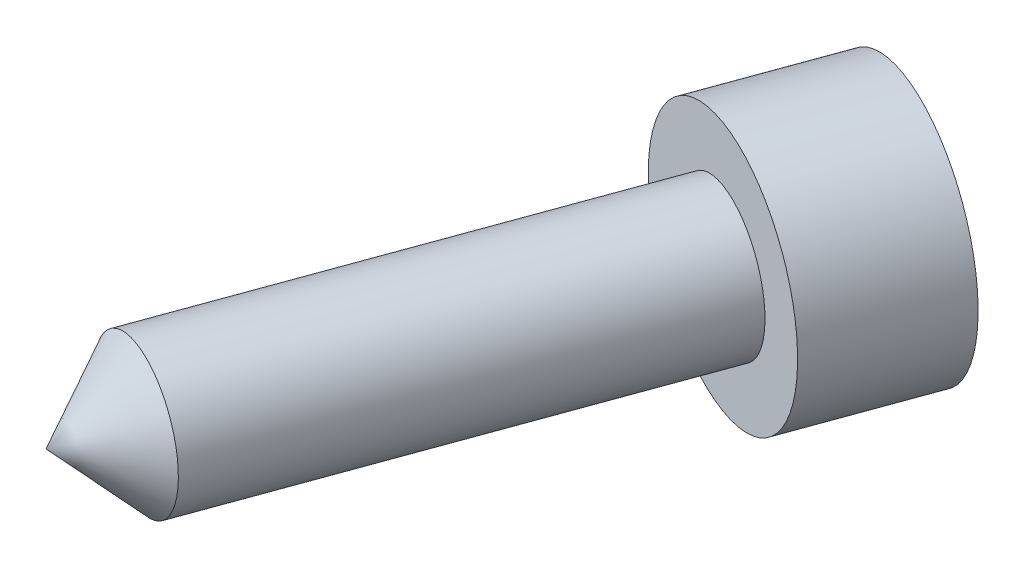
ISO-10303-21;
HEADER;
FILE_DESCRIPTION(('STEP AP214'),'2;1');
FILE_NAME('part.step','',(''),(''),'','','');
FILE_SCHEMA(('AUTOMOTIVE_DESIGN { 1 0 10303 214 1 1 1 1 }'));
ENDSEC;
DATA;
#1=APPLICATION_CONTEXT('core data for automotive mechanical design processes');
#2=APPLICATION_PROTOCOL_DEFINITION('international standard','automotive_design',2000,#1);
#3=PRODUCT_CONTEXT('',#1,'mechanical');
#4=PRODUCT('Part','Part','',(#3));
#5=PRODUCT_RELATED_PRODUCT_CATEGORY('part','',(#4));
#6=PRODUCT_DEFINITION_FORMATION('','',#4);
#7=PRODUCT_DEFINITION_CONTEXT('part definition',#1,'design');
#8=PRODUCT_DEFINITION('design','',#6,#7);
#9=PRODUCT_DEFINITION_SHAPE('','',#8);
#10=(LENGTH_UNIT() NAMED_UNIT(*) SI_UNIT(.MILLI.,.METRE.));
#11=(NAMED_UNIT(*) PLANE_ANGLE_UNIT() SI_UNIT($,.RADIAN.));
#12=(NAMED_UNIT(*) SI_UNIT($,.STERADIAN.) SOLID_ANGLE_UNIT());
#13=UNCERTAINTY_MEASURE_WITH_UNIT(LENGTH_MEASURE(1.E-05),#10,'distance_accuracy_value','');
#14=(GEOMETRIC_REPRESENTATION_CONTEXT(3) GLOBAL_UNCERTAINTY_ASSIGNED_CONTEXT((#13)) GLOBAL_UNIT_ASSIGNED_CONTEXT((#10,
#11,#12)) REPRESENTATION_CONTEXT('',''));
#15=CARTESIAN_POINT('',(0.,0.,0.));
#16=DIRECTION('',(0.,0.,1.));
#17=DIRECTION('',(1.,0.,0.));
#18=AXIS2_PLACEMENT_3D('',#15,#16,#17);
#19=CARTESIAN_POINT('',(67.9414684050174,-73.5382554774067,-16.5021819291962));
#20=DIRECTION('',(0.342020143325679,0.,-0.939692620785905));
#21=DIRECTION('',(0.,-1.,0.));
#22=AXIS2_PLACEMENT_3D('',#19,#20,#21);
#23=PLANE('',#22);
#24=CARTESIAN_POINT('',(66.4262140540001,-76.7882554774067,-17.0536894103088));
#25=DIRECTION('',(0.342020143325679,0.,-0.939692620785905));
#26=DIRECTION('',(0.,-1.,0.));
#27=AXIS2_PLACEMENT_3D('',#24,#25,#26);
#28=CIRCLE('',#27,1.);
#29=CARTESIAN_POINT('',(66.4262140540001,-75.7882554774067,-17.0536894103088));
#30=VERTEX_POINT('',#29);
#31=EDGE_CURVE('E131',#30,#30,#28,.T.);
#32=ORIENTED_EDGE('',*,*,#31,.T.);
#33=EDGE_LOOP('',(#32));
#34=FACE_BOUND('',#33,.T.);
#35=CARTESIAN_POINT('',(66.4262140540001,-76.7882554774067,-17.0536894103089));
#36=DIRECTION('',(0.342020143325679,0.,-0.939692620785905));
#37=DIRECTION('',(0.,1.,0.));
#38=AXIS2_PLACEMENT_3D('',#35,#36,#37);
#39=CIRCLE('',#38,1.775);
#40=CARTESIAN_POINT('',(66.4262140540001,-78.5632554774067,-17.0536894103089));
#41=VERTEX_POINT('',#40);
#42=EDGE_CURVE('E11',#41,#41,#39,.T.);
#43=ORIENTED_EDGE('',*,*,#42,.F.);
#44=EDGE_LOOP('',(#43));
#45=FACE_BOUND('',#44,.T.);
#46=ADVANCED_FACE('F17',(#34,#45),#23,.F.);
#47=CARTESIAN_POINT('',(68.6255086916687,-73.5382554774067,-18.381567170768));
#48=DIRECTION('',(0.342020143325679,0.,-0.939692620785905));
#49=DIRECTION('',(0.,-1.,0.));
#50=AXIS2_PLACEMENT_3D('',#47,#48,#49);
#51=PLANE('',#50);
#52=DIRECTION('',(-0.469846310392957,0.866025403784436,-0.171010071662841));
#53=VECTOR('',#52,1.);
#54=CARTESIAN_POINT('',(67.350523489613,-75.7311219683073,-18.8456238334462));
#55=LINE('',#54,#53);
#56=CARTESIAN_POINT('',(67.9240520220009,-76.7882554774067,-18.6368765191546));
#57=VERTEX_POINT('',#56);
#58=CARTESIAN_POINT('',(67.5171531813262,-76.0382554774067,-18.7849755855176));
#59=VERTEX_POINT('',#58);
#60=EDGE_CURVE('E84',#57,#59,#55,.T.);
#61=ORIENTED_EDGE('',*,*,#60,.T.);
#62=DIRECTION('',(-0.939692620785905,0.,-0.342020143325678));
#63=VECTOR('',#62,1.);
#64=CARTESIAN_POINT('',(68.0713309364974,-76.0382554774067,-18.5832713781428));
#65=LINE('',#64,#63);
#66=CARTESIAN_POINT('',(66.7033554999768,-76.0382554774067,-19.0811737182437));
#67=VERTEX_POINT('',#66);
#68=EDGE_CURVE('E75',#59,#67,#65,.T.);
#69=ORIENTED_EDGE('',*,*,#68,.T.);
#70=DIRECTION('',(-0.469846310392945,-0.866025403784443,-0.171010071662837));
#71=VECTOR('',#70,1.);
#72=CARTESIAN_POINT('',(67.4522481997816,-74.6578889865061,-18.8085990668555));
#73=LINE('',#72,#71);
#74=CARTESIAN_POINT('',(66.2964566593021,-76.7882554774067,-19.2292727846067));
#75=VERTEX_POINT('',#74);
#76=EDGE_CURVE('E80',#67,#75,#73,.T.);
#77=ORIENTED_EDGE('',*,*,#76,.T.);
#78=DIRECTION('',(0.469846310392957,-0.866025403784436,0.171010071662841));
#79=VECTOR('',#78,1.);
#80=CARTESIAN_POINT('',(65.9263775472515,-76.1061219683073,-19.3639705657168));
#81=LINE('',#80,#79);
#82=CARTESIAN_POINT('',(66.7033554999768,-77.5382554774067,-19.0811737182437));
#83=VERTEX_POINT('',#82);
#84=EDGE_CURVE('E119',#75,#83,#81,.T.);
#85=ORIENTED_EDGE('',*,*,#84,.T.);
#86=DIRECTION('',(0.939692620785905,0.,0.342020143325678));
#87=VECTOR('',#86,1.);
#88=CARTESIAN_POINT('',(67.6644320958228,-77.5382554774067,-18.7313704445058));
#89=LINE('',#88,#87);
#90=CARTESIAN_POINT('',(67.5171531813262,-77.5382554774067,-18.7849755855176));
#91=VERTEX_POINT('',#90);
#92=EDGE_CURVE('E115',#83,#91,#89,.T.);
#93=ORIENTED_EDGE('',*,*,#92,.T.);
#94=DIRECTION('',(0.46984631039295,0.86602540378444,0.171010071662838));
#95=VECTOR('',#94,1.);
#96=CARTESIAN_POINT('',(68.4694953014684,-75.7828889865061,-18.4383514009479));
#97=LINE('',#96,#95);
#98=EDGE_CURVE('E149',#91,#57,#97,.T.);
#99=ORIENTED_EDGE('',*,*,#98,.T.);
#100=EDGE_LOOP('',(#61,#69,#77,#85,#93,#99));
#101=FACE_BOUND('',#100,.T.);
#102=CARTESIAN_POINT('',(67.1102543406515,-76.7882554774067,-18.9330746518807));
#103=DIRECTION('',(0.342020143325679,0.,-0.939692620785905));
#104=DIRECTION('',(0.,1.,0.));
#105=AXIS2_PLACEMENT_3D('',#102,#103,#104);
#106=CIRCLE('',#105,1.775);
#107=CARTESIAN_POINT('',(67.1102543406515,-78.5632554774067,-18.9330746518807));
#108=VERTEX_POINT('',#107);
#109=EDGE_CURVE('E171',#108,#108,#106,.T.);
#110=ORIENTED_EDGE('',*,*,#109,.T.);
#111=EDGE_LOOP('',(#110));
#112=FACE_BOUND('',#111,.T.);
#113=ADVANCED_FACE('F19',(#101,#112),#51,.T.);
#114=CARTESIAN_POINT('',(66.4262140540001,-76.7882554774067,-17.0536894103089));
#115=DIRECTION('',(0.342020143325677,0.,-0.939692620785906));
#116=DIRECTION('',(0.,1.,0.));
#117=AXIS2_PLACEMENT_3D('',#114,#115,#116);
#118=CYLINDRICAL_SURFACE('',#117,1.775);
#119=ORIENTED_EDGE('',*,*,#109,.F.);
#120=DIRECTION('',(-0.342020143325677,0.,0.939692620785905));
#121=VECTOR('',#120,1.);
#122=CARTESIAN_POINT('',(66.4262140540001,-78.5632554774067,-17.0536894103089));
#123=LINE('',#122,#121);
#124=EDGE_CURVE('E26',#108,#41,#123,.T.);
#125=ORIENTED_EDGE('',*,*,#124,.T.);
#126=ORIENTED_EDGE('',*,*,#42,.T.);
#127=ORIENTED_EDGE('',*,*,#124,.F.);
#128=EDGE_LOOP('',(#119,#125,#126,#127));
#129=FACE_BOUND('',#128,.T.);
#130=ADVANCED_FACE('F175',(#129),#118,.T.);
#131=CARTESIAN_POINT('',(66.8537392331572,-76.7882554774067,-18.2283051862912));
#132=DIRECTION('',(-0.342020143325676,0.,0.939692620785906));
#133=DIRECTION('',(0.,1.,0.));
#134=AXIS2_PLACEMENT_3D('',#131,#132,#133);
#135=PLANE('',#134);
#136=DIRECTION('',(-0.939692620785905,0.,-0.342020143325678));
#137=VECTOR('',#136,1.);
#138=CARTESIAN_POINT('',(66.4468403924825,-76.0382554774067,-18.3764042526543));
#139=LINE('',#138,#137);
#140=CARTESIAN_POINT('',(67.2606380738319,-76.0382554774067,-18.0802061199282));
#141=VERTEX_POINT('',#140);
#142=CARTESIAN_POINT('',(66.4468403924825,-76.0382554774067,-18.3764042526542));
#143=VERTEX_POINT('',#142);
#144=EDGE_CURVE('E89',#141,#143,#139,.T.);
#145=ORIENTED_EDGE('',*,*,#144,.F.);
#146=DIRECTION('',(-0.469846310392957,0.866025403784436,-0.171010071662841));
#147=VECTOR('',#146,1.);
#148=CARTESIAN_POINT('',(67.2606380738319,-76.0382554774067,-18.0802061199282));
#149=LINE('',#148,#147);
#150=CARTESIAN_POINT('',(67.6675369145066,-76.7882554774067,-17.9321070535652));
#151=VERTEX_POINT('',#150);
#152=EDGE_CURVE('E125',#151,#141,#149,.T.);
#153=ORIENTED_EDGE('',*,*,#152,.F.);
#154=DIRECTION('',(0.46984631039295,0.86602540378444,0.171010071662838));
#155=VECTOR('',#154,1.);
#156=CARTESIAN_POINT('',(67.6675369145066,-76.7882554774067,-17.9321070535652));
#157=LINE('',#156,#155);
#158=CARTESIAN_POINT('',(67.2606380738319,-77.5382554774067,-18.0802061199282));
#159=VERTEX_POINT('',#158);
#160=EDGE_CURVE('E158',#159,#151,#157,.T.);
#161=ORIENTED_EDGE('',*,*,#160,.F.);
#162=DIRECTION('',(0.939692620785905,0.,0.342020143325678));
#163=VECTOR('',#162,1.);
#164=CARTESIAN_POINT('',(67.2606380738319,-77.5382554774067,-18.0802061199282));
#165=LINE('',#164,#163);
#166=CARTESIAN_POINT('',(66.4468403924825,-77.5382554774067,-18.3764042526542));
#167=VERTEX_POINT('',#166);
#168=EDGE_CURVE('E114',#167,#159,#165,.T.);
#169=ORIENTED_EDGE('',*,*,#168,.F.);
#170=DIRECTION('',(0.469846310392957,-0.866025403784436,0.171010071662841));
#171=VECTOR('',#170,1.);
#172=CARTESIAN_POINT('',(66.4468403924825,-77.5382554774067,-18.3764042526542));
#173=LINE('',#172,#171);
#174=CARTESIAN_POINT('',(66.0399415518078,-76.7882554774067,-18.5245033190173));
#175=VERTEX_POINT('',#174);
#176=EDGE_CURVE('E104',#175,#167,#173,.T.);
#177=ORIENTED_EDGE('',*,*,#176,.F.);
#178=DIRECTION('',(-0.469846310392945,-0.866025403784443,-0.171010071662837));
#179=VECTOR('',#178,1.);
#180=CARTESIAN_POINT('',(66.0399415518078,-76.7882554774067,-18.5245033190173));
#181=LINE('',#180,#179);
#182=EDGE_CURVE('E90',#143,#175,#181,.T.);
#183=ORIENTED_EDGE('',*,*,#182,.F.);
#184=EDGE_LOOP('',(#145,#153,#161,#169,#177,#183));
#185=FACE_BOUND('',#184,.T.);
#186=ADVANCED_FACE('F182',(#185),#135,.F.);
#187=CARTESIAN_POINT('',(67.5171531813262,-76.0382554774067,-18.7849755855176));
#188=DIRECTION('',(0.,1.,0.));
#189=DIRECTION('',(1.,0.,0.));
#190=AXIS2_PLACEMENT_3D('',#187,#188,#189);
#191=PLANE('',#190);
#192=ORIENTED_EDGE('',*,*,#68,.F.);
#193=DIRECTION('',(-0.342020143325676,0.,0.939692620785906));
#194=VECTOR('',#193,1.);
#195=CARTESIAN_POINT('',(67.5171531813262,-76.0382554774067,-18.7849755855176));
#196=LINE('',#195,#194);
#197=EDGE_CURVE('E129',#59,#141,#196,.T.);
#198=ORIENTED_EDGE('',*,*,#197,.T.);
#199=ORIENTED_EDGE('',*,*,#144,.T.);
#200=DIRECTION('',(-0.342020143325676,0.,0.939692620785906));
#201=VECTOR('',#200,1.);
#202=CARTESIAN_POINT('',(66.7033554999768,-76.0382554774067,-19.0811737182437));
#203=LINE('',#202,#201);
#204=EDGE_CURVE('E93',#67,#143,#203,.T.);
#205=ORIENTED_EDGE('',*,*,#204,.F.);
#206=EDGE_LOOP('',(#192,#198,#199,#205));
#207=FACE_BOUND('',#206,.T.);
#208=ADVANCED_FACE('F94',(#207),#191,.F.);
#209=CARTESIAN_POINT('',(66.7033554999768,-76.0382554774067,-19.0811737182437));
#210=DIRECTION('',(-0.813797681349375,0.499999999999993,-0.296198132726032));
#211=DIRECTION('',(-0.342020143325676,0.,0.939692620785906));
#212=AXIS2_PLACEMENT_3D('',#209,#210,#211);
#213=PLANE('',#212);
#214=ORIENTED_EDGE('',*,*,#76,.F.);
#215=ORIENTED_EDGE('',*,*,#204,.T.);
#216=ORIENTED_EDGE('',*,*,#182,.T.);
#217=DIRECTION('',(-0.342020143325676,0.,0.939692620785906));
#218=VECTOR('',#217,1.);
#219=CARTESIAN_POINT('',(66.2964566593021,-76.7882554774067,-19.2292727846067));
#220=LINE('',#219,#218);
#221=EDGE_CURVE('E101',#75,#175,#220,.T.);
#222=ORIENTED_EDGE('',*,*,#221,.F.);
#223=EDGE_LOOP('',(#214,#215,#216,#222));
#224=FACE_BOUND('',#223,.T.);
#225=ADVANCED_FACE('F99',(#224),#213,.F.);
#226=CARTESIAN_POINT('',(66.2964566593021,-76.7882554774067,-19.2292727846067));
#227=DIRECTION('',(-0.813797681349369,-0.5,-0.296198132726029));
#228=DIRECTION('',(-0.523490857349939,0.852031291837938,0.));
#229=AXIS2_PLACEMENT_3D('',#226,#227,#228);
#230=PLANE('',#229);
#231=ORIENTED_EDGE('',*,*,#84,.F.);
#232=ORIENTED_EDGE('',*,*,#221,.T.);
#233=ORIENTED_EDGE('',*,*,#176,.T.);
#234=DIRECTION('',(-0.342020143325676,0.,0.939692620785906));
#235=VECTOR('',#234,1.);
#236=CARTESIAN_POINT('',(66.7033554999768,-77.5382554774067,-19.0811737182437));
#237=LINE('',#236,#235);
#238=EDGE_CURVE('E111',#83,#167,#237,.T.);
#239=ORIENTED_EDGE('',*,*,#238,.F.);
#240=EDGE_LOOP('',(#231,#232,#233,#239));
#241=FACE_BOUND('',#240,.T.);
#242=ADVANCED_FACE('F212',(#241),#230,.F.);
#243=CARTESIAN_POINT('',(66.7033554999768,-77.5382554774067,-19.0811737182437));
#244=DIRECTION('',(0.,-1.,0.));
#245=DIRECTION('',(0.,0.,-1.));
#246=AXIS2_PLACEMENT_3D('',#243,#244,#245);
#247=PLANE('',#246);
#248=ORIENTED_EDGE('',*,*,#92,.F.);
#249=ORIENTED_EDGE('',*,*,#238,.T.);
#250=ORIENTED_EDGE('',*,*,#168,.T.);
#251=DIRECTION('',(-0.342020143325676,0.,0.939692620785906));
#252=VECTOR('',#251,1.);
#253=CARTESIAN_POINT('',(67.5171531813262,-77.5382554774067,-18.7849755855176));
#254=LINE('',#253,#252);
#255=EDGE_CURVE('E152',#91,#159,#254,.T.);
#256=ORIENTED_EDGE('',*,*,#255,.F.);
#257=EDGE_LOOP('',(#248,#249,#250,#256));
#258=FACE_BOUND('',#257,.T.);
#259=ADVANCED_FACE('F205',(#258),#247,.F.);
#260=CARTESIAN_POINT('',(67.5171531813262,-77.5382554774067,-18.7849755855176));
#261=DIRECTION('',(0.813797681349373,-0.5,0.296198132726031));
#262=DIRECTION('',(0.,-0.509677372062351,-0.860365606244006));
#263=AXIS2_PLACEMENT_3D('',#260,#261,#262);
#264=PLANE('',#263);
#265=ORIENTED_EDGE('',*,*,#98,.F.);
#266=ORIENTED_EDGE('',*,*,#255,.T.);
#267=ORIENTED_EDGE('',*,*,#160,.T.);
#268=DIRECTION('',(-0.342020143325676,0.,0.939692620785906));
#269=VECTOR('',#268,1.);
#270=CARTESIAN_POINT('',(67.9240520220009,-76.7882554774067,-18.6368765191546));
#271=LINE('',#270,#269);
#272=EDGE_CURVE('E130',#57,#151,#271,.T.);
#273=ORIENTED_EDGE('',*,*,#272,.F.);
#274=EDGE_LOOP('',(#265,#266,#267,#273));
#275=FACE_BOUND('',#274,.T.);
#276=ADVANCED_FACE('F201',(#275),#264,.F.);
#277=CARTESIAN_POINT('',(67.9240520220009,-76.7882554774067,-18.6368765191546));
#278=DIRECTION('',(0.813797681349369,0.5,0.296198132726029));
#279=DIRECTION('',(0.,0.509677372062343,-0.860365606244011));
#280=AXIS2_PLACEMENT_3D('',#277,#278,#279);
#281=PLANE('',#280);
#282=ORIENTED_EDGE('',*,*,#60,.F.);
#283=ORIENTED_EDGE('',*,*,#272,.T.);
#284=ORIENTED_EDGE('',*,*,#152,.T.);
#285=ORIENTED_EDGE('',*,*,#197,.F.);
#286=EDGE_LOOP('',(#282,#283,#284,#285));
#287=FACE_BOUND('',#286,.T.);
#288=ADVANCED_FACE('F197',(#287),#281,.F.);
#289=CARTESIAN_POINT('',(66.4262140540001,-76.7882554774067,-17.0536894103088));
#290=DIRECTION('',(-0.342020143325679,0.,0.939692620785905));
#291=DIRECTION('',(0.,-1.,0.));
#292=AXIS2_PLACEMENT_3D('',#289,#290,#291);
#293=CYLINDRICAL_SURFACE('',#292,1.);
#294=CARTESIAN_POINT('',(64.2030831223832,-76.7882554774067,-10.9456873752005));
#295=DIRECTION('',(-0.342020143325679,0.,0.939692620785905));
#296=DIRECTION('',(0.,-1.,0.));
#297=AXIS2_PLACEMENT_3D('',#294,#295,#296);
#298=CIRCLE('',#297,1.);
#299=CARTESIAN_POINT('',(64.2030831223832,-75.7882554774067,-10.9456873752005));
#300=VERTEX_POINT('',#299);
#301=EDGE_CURVE('E124',#300,#300,#298,.T.);
#302=ORIENTED_EDGE('',*,*,#301,.F.);
#303=DIRECTION('',(0.342020143325679,0.,-0.939692620785905));
#304=VECTOR('',#303,1.);
#305=CARTESIAN_POINT('',(66.4262140540001,-75.7882554774067,-17.0536894103088));
#306=LINE('',#305,#304);
#307=EDGE_CURVE('E135',#300,#30,#306,.T.);
#308=ORIENTED_EDGE('',*,*,#307,.T.);
#309=ORIENTED_EDGE('',*,*,#31,.F.);
#310=ORIENTED_EDGE('',*,*,#307,.F.);
#311=EDGE_LOOP('',(#302,#308,#309,#310));
#312=FACE_BOUND('',#311,.T.);
#313=ADVANCED_FACE('F193',(#312),#293,.T.);
#314=CARTESIAN_POINT('',(64.2030831223832,-76.7882554774067,-10.9456873752005));
#315=DIRECTION('',(0.342020143325679,0.,-0.939692620785905));
#316=DIRECTION('',(0.,-1.,0.));
#317=AXIS2_PLACEMENT_3D('',#314,#315,#316);
#318=CONICAL_SURFACE('',#317,1.,0.78539816339745);
#319=DIRECTION('',(0.241844762647982,0.707106781186549,-0.664463024388671));
#320=VECTOR('',#319,1.);
#321=CARTESIAN_POINT('',(64.2030831223832,-75.7882554774067,-10.9456873752005));
#322=LINE('',#321,#320);
#323=CARTESIAN_POINT('',(63.8610629790575,-76.7882554774067,-10.0059947544146));
#324=VERTEX_POINT('',#323);
#325=EDGE_CURVE('E120',#324,#300,#322,.T.);
#326=ORIENTED_EDGE('',*,*,#325,.T.);
#327=ORIENTED_EDGE('',*,*,#301,.T.);
#328=ORIENTED_EDGE('',*,*,#325,.F.);
#329=EDGE_LOOP('',(#326,#327,#328));
#330=FACE_BOUND('',#329,.T.);
#331=ADVANCED_FACE('F190',(#330),#318,.T.);
#332=CLOSED_SHELL('',(#46,#113,#130,#186,#208,#225,#242,#259,#276,#288,#313,#331));
#333=MANIFOLD_SOLID_BREP('B1',#332);
#334=ADVANCED_BREP_SHAPE_REPRESENTATION('',(#18,#333),#14);
#335=SHAPE_DEFINITION_REPRESENTATION(#9,#334);
ENDSEC;
END-ISO-10303-21;
